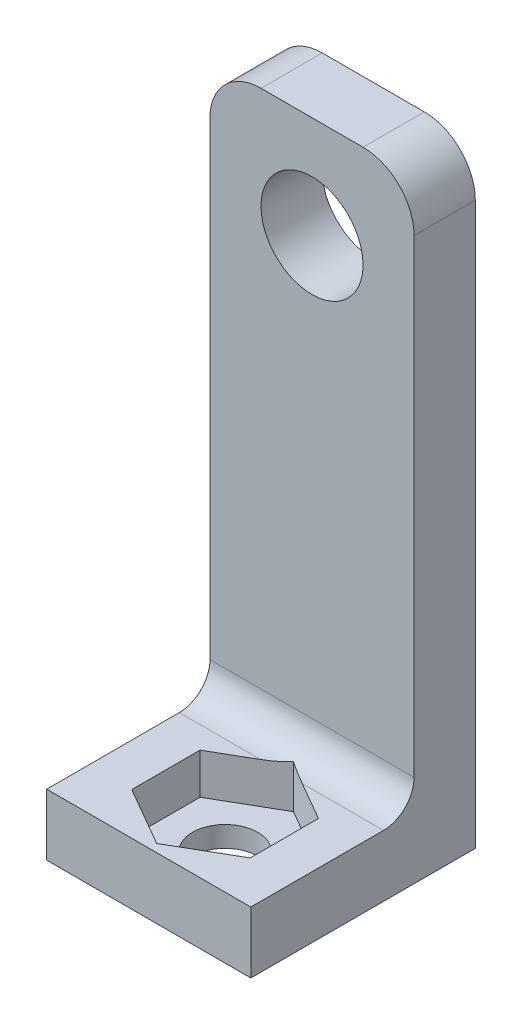
ISO-10303-21;
HEADER;
FILE_DESCRIPTION(('STEP AP214'),'2;1');
FILE_NAME('part.step','',(''),(''),'','','');
FILE_SCHEMA(('AUTOMOTIVE_DESIGN { 1 0 10303 214 1 1 1 1 }'));
ENDSEC;
DATA;
#1=APPLICATION_CONTEXT('core data for automotive mechanical design processes');
#2=APPLICATION_PROTOCOL_DEFINITION('international standard','automotive_design',2000,#1);
#3=PRODUCT_CONTEXT('',#1,'mechanical');
#4=PRODUCT('Part','Part','',(#3));
#5=PRODUCT_RELATED_PRODUCT_CATEGORY('part','',(#4));
#6=PRODUCT_DEFINITION_FORMATION('','',#4);
#7=PRODUCT_DEFINITION_CONTEXT('part definition',#1,'design');
#8=PRODUCT_DEFINITION('design','',#6,#7);
#9=PRODUCT_DEFINITION_SHAPE('','',#8);
#10=(LENGTH_UNIT() NAMED_UNIT(*) SI_UNIT(.MILLI.,.METRE.));
#11=(NAMED_UNIT(*) PLANE_ANGLE_UNIT() SI_UNIT($,.RADIAN.));
#12=(NAMED_UNIT(*) SI_UNIT($,.STERADIAN.) SOLID_ANGLE_UNIT());
#13=UNCERTAINTY_MEASURE_WITH_UNIT(LENGTH_MEASURE(1.E-05),#10,'distance_accuracy_value','');
#14=(GEOMETRIC_REPRESENTATION_CONTEXT(3) GLOBAL_UNCERTAINTY_ASSIGNED_CONTEXT((#13)) GLOBAL_UNIT_ASSIGNED_CONTEXT((#10,
#11,#12)) REPRESENTATION_CONTEXT('',''));
#15=CARTESIAN_POINT('',(0.,0.,0.));
#16=DIRECTION('',(0.,0.,1.));
#17=DIRECTION('',(1.,0.,0.));
#18=AXIS2_PLACEMENT_3D('',#15,#16,#17);
#19=CARTESIAN_POINT('',(0.,-18.9884683776237,7.25918718706481));
#20=DIRECTION('',(0.,1.,0.));
#21=DIRECTION('',(0.,0.,1.));
#22=AXIS2_PLACEMENT_3D('',#19,#20,#21);
#23=CYLINDRICAL_SURFACE('',#22,1.6);
#24=CARTESIAN_POINT('',(0.,-15.,7.25918718706481));
#25=DIRECTION('',(0.,1.,0.));
#26=DIRECTION('',(0.,0.,1.));
#27=AXIS2_PLACEMENT_3D('',#24,#25,#26);
#28=CIRCLE('',#27,1.6);
#29=CARTESIAN_POINT('',(0.,-15.,8.85918718706481));
#30=VERTEX_POINT('',#29);
#31=EDGE_CURVE('E207',#30,#30,#28,.T.);
#32=ORIENTED_EDGE('',*,*,#31,.F.);
#33=EDGE_LOOP('',(#32));
#34=FACE_BOUND('',#33,.T.);
#35=CARTESIAN_POINT('',(0.,-13.9884683776237,7.25918718706481));
#36=DIRECTION('',(0.,1.,0.));
#37=DIRECTION('',(0.,0.,1.));
#38=AXIS2_PLACEMENT_3D('',#35,#36,#37);
#39=CIRCLE('',#38,1.6);
#40=CARTESIAN_POINT('',(0.,-13.9884683776237,8.85918718706481));
#41=VERTEX_POINT('',#40);
#42=EDGE_CURVE('E199',#41,#41,#39,.F.);
#43=ORIENTED_EDGE('',*,*,#42,.F.);
#44=EDGE_LOOP('',(#43));
#45=FACE_BOUND('',#44,.T.);
#46=ADVANCED_FACE('F35',(#34,#45),#23,.F.);
#47=CARTESIAN_POINT('',(5.,15.,3.));
#48=DIRECTION('',(-1.,0.,0.));
#49=DIRECTION('',(0.,-1.,0.));
#50=AXIS2_PLACEMENT_3D('',#47,#48,#49);
#51=PLANE('',#50);
#52=DIRECTION('',(0.,1.,0.));
#53=VECTOR('',#52,1.);
#54=CARTESIAN_POINT('',(5.,15.,0.));
#55=LINE('',#54,#53);
#56=CARTESIAN_POINT('',(5.,-15.,0.));
#57=VERTEX_POINT('',#56);
#58=CARTESIAN_POINT('',(5.,12.5,0.));
#59=VERTEX_POINT('',#58);
#60=EDGE_CURVE('E229',#57,#59,#55,.T.);
#61=ORIENTED_EDGE('',*,*,#60,.T.);
#62=DIRECTION('',(0.,0.,-1.));
#63=VECTOR('',#62,1.);
#64=CARTESIAN_POINT('',(5.,12.5,3.));
#65=LINE('',#64,#63);
#66=CARTESIAN_POINT('',(5.,12.5,3.));
#67=VERTEX_POINT('',#66);
#68=EDGE_CURVE('E259',#59,#67,#65,.F.);
#69=ORIENTED_EDGE('',*,*,#68,.T.);
#70=DIRECTION('',(0.,1.,0.));
#71=VECTOR('',#70,1.);
#72=CARTESIAN_POINT('',(5.,15.,3.));
#73=LINE('',#72,#71);
#74=CARTESIAN_POINT('',(5.,-10.4884683776237,3.));
#75=VERTEX_POINT('',#74);
#76=EDGE_CURVE('E232',#75,#67,#73,.T.);
#77=ORIENTED_EDGE('',*,*,#76,.F.);
#78=CARTESIAN_POINT('',(5.,-10.4884683776237,4.5));
#79=DIRECTION('',(-1.,0.,0.));
#80=DIRECTION('',(0.,-1.,0.));
#81=AXIS2_PLACEMENT_3D('',#78,#79,#80);
#82=CIRCLE('',#81,1.5);
#83=CARTESIAN_POINT('',(5.,-11.9884683776237,4.5));
#84=VERTEX_POINT('',#83);
#85=EDGE_CURVE('E11',#75,#84,#82,.T.);
#86=ORIENTED_EDGE('',*,*,#85,.T.);
#87=DIRECTION('',(0.,0.,-1.));
#88=VECTOR('',#87,1.);
#89=CARTESIAN_POINT('',(5.,-11.9884683776237,11.));
#90=LINE('',#89,#88);
#91=CARTESIAN_POINT('',(5.,-11.9884683776237,11.));
#92=VERTEX_POINT('',#91);
#93=EDGE_CURVE('E222',#92,#84,#90,.T.);
#94=ORIENTED_EDGE('',*,*,#93,.F.);
#95=DIRECTION('',(0.,1.,0.));
#96=VECTOR('',#95,1.);
#97=CARTESIAN_POINT('',(5.,-15.,11.));
#98=LINE('',#97,#96);
#99=CARTESIAN_POINT('',(5.,-15.,11.));
#100=VERTEX_POINT('',#99);
#101=EDGE_CURVE('E216',#100,#92,#98,.T.);
#102=ORIENTED_EDGE('',*,*,#101,.F.);
#103=DIRECTION('',(0.,0.,-1.));
#104=VECTOR('',#103,1.);
#105=CARTESIAN_POINT('',(5.,-15.,3.));
#106=LINE('',#105,#104);
#107=EDGE_CURVE('E240',#100,#57,#106,.T.);
#108=ORIENTED_EDGE('',*,*,#107,.T.);
#109=EDGE_LOOP('',(#61,#69,#77,#86,#94,#102,#108));
#110=FACE_BOUND('',#109,.T.);
#111=ADVANCED_FACE('F303',(#110),#51,.F.);
#112=CARTESIAN_POINT('',(-5.,15.,3.));
#113=DIRECTION('',(0.,-1.,0.));
#114=DIRECTION('',(0.,0.,-1.));
#115=AXIS2_PLACEMENT_3D('',#112,#113,#114);
#116=PLANE('',#115);
#117=DIRECTION('',(-1.,0.,0.));
#118=VECTOR('',#117,1.);
#119=CARTESIAN_POINT('',(-5.,15.,0.));
#120=LINE('',#119,#118);
#121=CARTESIAN_POINT('',(2.5,15.,0.));
#122=VERTEX_POINT('',#121);
#123=CARTESIAN_POINT('',(-2.5,15.,0.));
#124=VERTEX_POINT('',#123);
#125=EDGE_CURVE('E243',#122,#124,#120,.T.);
#126=ORIENTED_EDGE('',*,*,#125,.T.);
#127=DIRECTION('',(0.,0.,-1.));
#128=VECTOR('',#127,1.);
#129=CARTESIAN_POINT('',(-2.5,15.,3.));
#130=LINE('',#129,#128);
#131=CARTESIAN_POINT('',(-2.5,15.,3.));
#132=VERTEX_POINT('',#131);
#133=EDGE_CURVE('E269',#124,#132,#130,.F.);
#134=ORIENTED_EDGE('',*,*,#133,.T.);
#135=DIRECTION('',(-1.,0.,0.));
#136=VECTOR('',#135,1.);
#137=CARTESIAN_POINT('',(-5.,15.,3.));
#138=LINE('',#137,#136);
#139=CARTESIAN_POINT('',(2.5,15.,3.));
#140=VERTEX_POINT('',#139);
#141=EDGE_CURVE('E234',#140,#132,#138,.T.);
#142=ORIENTED_EDGE('',*,*,#141,.F.);
#143=DIRECTION('',(0.,0.,-1.));
#144=VECTOR('',#143,1.);
#145=CARTESIAN_POINT('',(2.5,15.,3.));
#146=LINE('',#145,#144);
#147=EDGE_CURVE('E254',#140,#122,#146,.T.);
#148=ORIENTED_EDGE('',*,*,#147,.T.);
#149=EDGE_LOOP('',(#126,#134,#142,#148));
#150=FACE_BOUND('',#149,.T.);
#151=ADVANCED_FACE('F314',(#150),#116,.F.);
#152=CARTESIAN_POINT('',(-5.,15.,3.));
#153=DIRECTION('',(1.,0.,0.));
#154=DIRECTION('',(0.,1.,0.));
#155=AXIS2_PLACEMENT_3D('',#152,#153,#154);
#156=PLANE('',#155);
#157=DIRECTION('',(0.,-1.,0.));
#158=VECTOR('',#157,1.);
#159=CARTESIAN_POINT('',(-5.,15.,3.));
#160=LINE('',#159,#158);
#161=CARTESIAN_POINT('',(-5.,12.5,3.));
#162=VERTEX_POINT('',#161);
#163=CARTESIAN_POINT('',(-5.,-10.4884683776237,3.));
#164=VERTEX_POINT('',#163);
#165=EDGE_CURVE('E238',#162,#164,#160,.T.);
#166=ORIENTED_EDGE('',*,*,#165,.F.);
#167=DIRECTION('',(0.,0.,-1.));
#168=VECTOR('',#167,1.);
#169=CARTESIAN_POINT('',(-5.,12.5,3.));
#170=LINE('',#169,#168);
#171=CARTESIAN_POINT('',(-5.,12.5,0.));
#172=VERTEX_POINT('',#171);
#173=EDGE_CURVE('E264',#162,#172,#170,.T.);
#174=ORIENTED_EDGE('',*,*,#173,.T.);
#175=DIRECTION('',(0.,-1.,0.));
#176=VECTOR('',#175,1.);
#177=CARTESIAN_POINT('',(-5.,15.,0.));
#178=LINE('',#177,#176);
#179=CARTESIAN_POINT('',(-5.,-15.,0.));
#180=VERTEX_POINT('',#179);
#181=EDGE_CURVE('E246',#172,#180,#178,.T.);
#182=ORIENTED_EDGE('',*,*,#181,.T.);
#183=DIRECTION('',(0.,0.,-1.));
#184=VECTOR('',#183,1.);
#185=CARTESIAN_POINT('',(-5.,-15.,3.));
#186=LINE('',#185,#184);
#187=CARTESIAN_POINT('',(-5.,-15.,11.));
#188=VERTEX_POINT('',#187);
#189=EDGE_CURVE('E251',#188,#180,#186,.T.);
#190=ORIENTED_EDGE('',*,*,#189,.F.);
#191=DIRECTION('',(0.,-1.,0.));
#192=VECTOR('',#191,1.);
#193=CARTESIAN_POINT('',(-5.,-15.,11.));
#194=LINE('',#193,#192);
#195=CARTESIAN_POINT('',(-5.,-11.9884683776237,11.));
#196=VERTEX_POINT('',#195);
#197=EDGE_CURVE('E210',#196,#188,#194,.T.);
#198=ORIENTED_EDGE('',*,*,#197,.F.);
#199=DIRECTION('',(0.,0.,-1.));
#200=VECTOR('',#199,1.);
#201=CARTESIAN_POINT('',(-5.,-11.9884683776237,11.));
#202=LINE('',#201,#200);
#203=CARTESIAN_POINT('',(-5.,-11.9884683776237,4.5));
#204=VERTEX_POINT('',#203);
#205=EDGE_CURVE('E220',#196,#204,#202,.T.);
#206=ORIENTED_EDGE('',*,*,#205,.T.);
#207=CARTESIAN_POINT('',(-5.,-10.4884683776237,4.5));
#208=DIRECTION('',(1.,0.,0.));
#209=DIRECTION('',(0.,1.,0.));
#210=AXIS2_PLACEMENT_3D('',#207,#208,#209);
#211=CIRCLE('',#210,1.5);
#212=EDGE_CURVE('E43',#204,#164,#211,.T.);
#213=ORIENTED_EDGE('',*,*,#212,.T.);
#214=EDGE_LOOP('',(#166,#174,#182,#190,#198,#206,#213));
#215=FACE_BOUND('',#214,.T.);
#216=ADVANCED_FACE('F320',(#215),#156,.F.);
#217=CARTESIAN_POINT('',(-5.,-15.,3.));
#218=DIRECTION('',(0.,1.,0.));
#219=DIRECTION('',(0.,0.,1.));
#220=AXIS2_PLACEMENT_3D('',#217,#218,#219);
#221=PLANE('',#220);
#222=ORIENTED_EDGE('',*,*,#31,.T.);
#223=EDGE_LOOP('',(#222));
#224=FACE_BOUND('',#223,.T.);
#225=DIRECTION('',(1.,0.,0.));
#226=VECTOR('',#225,1.);
#227=CARTESIAN_POINT('',(-5.,-15.,0.));
#228=LINE('',#227,#226);
#229=EDGE_CURVE('E235',#180,#57,#228,.T.);
#230=ORIENTED_EDGE('',*,*,#229,.T.);
#231=ORIENTED_EDGE('',*,*,#107,.F.);
#232=DIRECTION('',(1.,0.,0.));
#233=VECTOR('',#232,1.);
#234=CARTESIAN_POINT('',(-5.,-15.,11.));
#235=LINE('',#234,#233);
#236=EDGE_CURVE('E213',#188,#100,#235,.T.);
#237=ORIENTED_EDGE('',*,*,#236,.F.);
#238=ORIENTED_EDGE('',*,*,#189,.T.);
#239=EDGE_LOOP('',(#230,#231,#237,#238));
#240=FACE_BOUND('',#239,.T.);
#241=ADVANCED_FACE('F326',(#224,#240),#221,.F.);
#242=CARTESIAN_POINT('',(0.,0.,3.));
#243=DIRECTION('',(0.,0.,1.));
#244=DIRECTION('',(1.,0.,0.));
#245=AXIS2_PLACEMENT_3D('',#242,#243,#244);
#246=PLANE('',#245);
#247=ORIENTED_EDGE('',*,*,#165,.T.);
#248=DIRECTION('',(-1.,0.,0.));
#249=VECTOR('',#248,1.);
#250=CARTESIAN_POINT('',(0.,-10.4884683776237,3.));
#251=LINE('',#250,#249);
#252=EDGE_CURVE('E280',#164,#75,#251,.F.);
#253=ORIENTED_EDGE('',*,*,#252,.T.);
#254=ORIENTED_EDGE('',*,*,#76,.T.);
#255=CARTESIAN_POINT('',(2.5,12.5,3.));
#256=DIRECTION('',(0.,0.,1.));
#257=DIRECTION('',(1.,0.,0.));
#258=AXIS2_PLACEMENT_3D('',#255,#256,#257);
#259=CIRCLE('',#258,2.5);
#260=EDGE_CURVE('E262',#67,#140,#259,.T.);
#261=ORIENTED_EDGE('',*,*,#260,.T.);
#262=ORIENTED_EDGE('',*,*,#141,.T.);
#263=CARTESIAN_POINT('',(-2.5,12.5,3.));
#264=DIRECTION('',(0.,0.,1.));
#265=DIRECTION('',(1.,0.,0.));
#266=AXIS2_PLACEMENT_3D('',#263,#264,#265);
#267=CIRCLE('',#266,2.5);
#268=EDGE_CURVE('E271',#132,#162,#267,.T.);
#269=ORIENTED_EDGE('',*,*,#268,.T.);
#270=EDGE_LOOP('',(#247,#253,#254,#261,#262,#269));
#271=FACE_BOUND('',#270,.T.);
#272=CARTESIAN_POINT('',(0.,10.,3.));
#273=DIRECTION('',(0.,0.,-1.));
#274=DIRECTION('',(-1.,0.,0.));
#275=AXIS2_PLACEMENT_3D('',#272,#273,#274);
#276=CIRCLE('',#275,2.5);
#277=CARTESIAN_POINT('',(-2.5,10.,3.));
#278=VERTEX_POINT('',#277);
#279=EDGE_CURVE('E226',#278,#278,#276,.T.);
#280=ORIENTED_EDGE('',*,*,#279,.T.);
#281=EDGE_LOOP('',(#280));
#282=FACE_BOUND('',#281,.T.);
#283=ADVANCED_FACE('F300',(#271,#282),#246,.T.);
#284=CARTESIAN_POINT('',(0.,0.,0.));
#285=DIRECTION('',(0.,0.,1.));
#286=DIRECTION('',(1.,0.,0.));
#287=AXIS2_PLACEMENT_3D('',#284,#285,#286);
#288=PLANE('',#287);
#289=CARTESIAN_POINT('',(0.,10.,0.));
#290=DIRECTION('',(0.,0.,-1.));
#291=DIRECTION('',(-1.,0.,0.));
#292=AXIS2_PLACEMENT_3D('',#289,#290,#291);
#293=CIRCLE('',#292,2.5);
#294=CARTESIAN_POINT('',(-2.5,10.,0.));
#295=VERTEX_POINT('',#294);
#296=EDGE_CURVE('E225',#295,#295,#293,.T.);
#297=ORIENTED_EDGE('',*,*,#296,.F.);
#298=EDGE_LOOP('',(#297));
#299=FACE_BOUND('',#298,.T.);
#300=ORIENTED_EDGE('',*,*,#181,.F.);
#301=CARTESIAN_POINT('',(-2.5,12.5,0.));
#302=DIRECTION('',(0.,0.,1.));
#303=DIRECTION('',(1.,0.,0.));
#304=AXIS2_PLACEMENT_3D('',#301,#302,#303);
#305=CIRCLE('',#304,2.5);
#306=EDGE_CURVE('E267',#172,#124,#305,.F.);
#307=ORIENTED_EDGE('',*,*,#306,.T.);
#308=ORIENTED_EDGE('',*,*,#125,.F.);
#309=CARTESIAN_POINT('',(2.5,12.5,0.));
#310=DIRECTION('',(0.,0.,1.));
#311=DIRECTION('',(1.,0.,0.));
#312=AXIS2_PLACEMENT_3D('',#309,#310,#311);
#313=CIRCLE('',#312,2.5);
#314=EDGE_CURVE('E257',#122,#59,#313,.F.);
#315=ORIENTED_EDGE('',*,*,#314,.T.);
#316=ORIENTED_EDGE('',*,*,#60,.F.);
#317=ORIENTED_EDGE('',*,*,#229,.F.);
#318=EDGE_LOOP('',(#300,#307,#308,#315,#316,#317));
#319=FACE_BOUND('',#318,.T.);
#320=ADVANCED_FACE('F324',(#299,#319),#288,.F.);
#321=CARTESIAN_POINT('',(0.,10.,3.));
#322=DIRECTION('',(0.,0.,-1.));
#323=DIRECTION('',(-1.,0.,0.));
#324=AXIS2_PLACEMENT_3D('',#321,#322,#323);
#325=CYLINDRICAL_SURFACE('',#324,2.5);
#326=ORIENTED_EDGE('',*,*,#279,.F.);
#327=EDGE_LOOP('',(#326));
#328=FACE_BOUND('',#327,.T.);
#329=ORIENTED_EDGE('',*,*,#296,.T.);
#330=EDGE_LOOP('',(#329));
#331=FACE_BOUND('',#330,.T.);
#332=ADVANCED_FACE('F365',(#328,#331),#325,.F.);
#333=CARTESIAN_POINT('',(2.5,12.5,3.));
#334=DIRECTION('',(0.,0.,-1.));
#335=DIRECTION('',(-1.,0.,0.));
#336=AXIS2_PLACEMENT_3D('',#333,#334,#335);
#337=CYLINDRICAL_SURFACE('',#336,2.5);
#338=ORIENTED_EDGE('',*,*,#260,.F.);
#339=ORIENTED_EDGE('',*,*,#68,.F.);
#340=ORIENTED_EDGE('',*,*,#314,.F.);
#341=ORIENTED_EDGE('',*,*,#147,.F.);
#342=EDGE_LOOP('',(#338,#339,#340,#341));
#343=FACE_BOUND('',#342,.T.);
#344=ADVANCED_FACE('F310',(#343),#337,.T.);
#345=CARTESIAN_POINT('',(-2.5,12.5,3.));
#346=DIRECTION('',(0.,0.,-1.));
#347=DIRECTION('',(-1.,0.,0.));
#348=AXIS2_PLACEMENT_3D('',#345,#346,#347);
#349=CYLINDRICAL_SURFACE('',#348,2.5);
#350=ORIENTED_EDGE('',*,*,#268,.F.);
#351=ORIENTED_EDGE('',*,*,#133,.F.);
#352=ORIENTED_EDGE('',*,*,#306,.F.);
#353=ORIENTED_EDGE('',*,*,#173,.F.);
#354=EDGE_LOOP('',(#350,#351,#352,#353));
#355=FACE_BOUND('',#354,.T.);
#356=ADVANCED_FACE('F318',(#355),#349,.T.);
#357=CARTESIAN_POINT('',(-5.,-11.9884683776237,11.));
#358=DIRECTION('',(0.,-1.,0.));
#359=DIRECTION('',(0.,0.,-1.));
#360=AXIS2_PLACEMENT_3D('',#357,#358,#359);
#361=PLANE('',#360);
#362=ORIENTED_EDGE('',*,*,#93,.T.);
#363=DIRECTION('',(-1.,0.,0.));
#364=VECTOR('',#363,1.);
#365=CARTESIAN_POINT('',(-5.,-11.9884683776237,4.5));
#366=LINE('',#365,#364);
#367=CARTESIAN_POINT('',(1.0209476044107,-11.9884683776237,4.5));
#368=VERTEX_POINT('',#367);
#369=EDGE_CURVE('E277',#84,#368,#366,.T.);
#370=ORIENTED_EDGE('',*,*,#369,.T.);
#371=DIRECTION('',(-0.866025403784439,0.,-0.5));
#372=VECTOR('',#371,1.);
#373=CARTESIAN_POINT('',(2.9,-11.9884683776237,5.58487140641489));
#374=LINE('',#373,#372);
#375=CARTESIAN_POINT('',(2.9,-11.9884683776237,5.58487140641489));
#376=VERTEX_POINT('',#375);
#377=EDGE_CURVE('E190',#376,#368,#374,.T.);
#378=ORIENTED_EDGE('',*,*,#377,.F.);
#379=DIRECTION('',(0.,0.,-1.));
#380=VECTOR('',#379,1.);
#381=CARTESIAN_POINT('',(2.9,-11.9884683776237,8.93350296771472));
#382=LINE('',#381,#380);
#383=CARTESIAN_POINT('',(2.9,-11.9884683776237,8.93350296771472));
#384=VERTEX_POINT('',#383);
#385=EDGE_CURVE('E188',#384,#376,#382,.T.);
#386=ORIENTED_EDGE('',*,*,#385,.F.);
#387=DIRECTION('',(0.866025403784439,0.,-0.5));
#388=VECTOR('',#387,1.);
#389=CARTESIAN_POINT('',(0.,-11.9884683776237,10.6078187483646));
#390=LINE('',#389,#388);
#391=CARTESIAN_POINT('',(0.,-11.9884683776237,10.6078187483646));
#392=VERTEX_POINT('',#391);
#393=EDGE_CURVE('E155',#392,#384,#390,.T.);
#394=ORIENTED_EDGE('',*,*,#393,.F.);
#395=DIRECTION('',(0.866025403784439,0.,0.5));
#396=VECTOR('',#395,1.);
#397=CARTESIAN_POINT('',(-2.9,-11.9884683776237,8.93350296771472));
#398=LINE('',#397,#396);
#399=CARTESIAN_POINT('',(-2.9,-11.9884683776237,8.93350296771472));
#400=VERTEX_POINT('',#399);
#401=EDGE_CURVE('E174',#400,#392,#398,.T.);
#402=ORIENTED_EDGE('',*,*,#401,.F.);
#403=DIRECTION('',(0.,0.,1.));
#404=VECTOR('',#403,1.);
#405=CARTESIAN_POINT('',(-2.9,-11.9884683776237,5.58487140641489));
#406=LINE('',#405,#404);
#407=CARTESIAN_POINT('',(-2.9,-11.9884683776237,5.58487140641489));
#408=VERTEX_POINT('',#407);
#409=EDGE_CURVE('E177',#408,#400,#406,.T.);
#410=ORIENTED_EDGE('',*,*,#409,.F.);
#411=DIRECTION('',(-0.866025403784439,0.,0.5));
#412=VECTOR('',#411,1.);
#413=CARTESIAN_POINT('',(0.,-11.9884683776237,3.91055562576498));
#414=LINE('',#413,#412);
#415=CARTESIAN_POINT('',(-1.0209476044107,-11.9884683776237,4.5));
#416=VERTEX_POINT('',#415);
#417=EDGE_CURVE('E193',#416,#408,#414,.T.);
#418=ORIENTED_EDGE('',*,*,#417,.F.);
#419=DIRECTION('',(-1.,0.,0.));
#420=VECTOR('',#419,1.);
#421=CARTESIAN_POINT('',(-5.,-11.9884683776237,4.5));
#422=LINE('',#421,#420);
#423=EDGE_CURVE('E273',#416,#204,#422,.T.);
#424=ORIENTED_EDGE('',*,*,#423,.T.);
#425=ORIENTED_EDGE('',*,*,#205,.F.);
#426=DIRECTION('',(-1.,0.,0.));
#427=VECTOR('',#426,1.);
#428=CARTESIAN_POINT('',(-5.,-11.9884683776237,11.));
#429=LINE('',#428,#427);
#430=EDGE_CURVE('E218',#92,#196,#429,.T.);
#431=ORIENTED_EDGE('',*,*,#430,.F.);
#432=EDGE_LOOP('',(#362,#370,#378,#386,#394,#402,#410,#418,#424,#425,#431));
#433=FACE_BOUND('',#432,.T.);
#434=ADVANCED_FACE('F292',(#433),#361,.F.);
#435=CARTESIAN_POINT('',(0.,0.,11.));
#436=DIRECTION('',(0.,0.,-1.));
#437=DIRECTION('',(-1.,0.,0.));
#438=AXIS2_PLACEMENT_3D('',#435,#436,#437);
#439=PLANE('',#438);
#440=ORIENTED_EDGE('',*,*,#197,.T.);
#441=ORIENTED_EDGE('',*,*,#236,.T.);
#442=ORIENTED_EDGE('',*,*,#101,.T.);
#443=ORIENTED_EDGE('',*,*,#430,.T.);
#444=EDGE_LOOP('',(#440,#441,#442,#443));
#445=FACE_BOUND('',#444,.T.);
#446=ADVANCED_FACE('F331',(#445),#439,.F.);
#447=CARTESIAN_POINT('',(0.,-13.9884683776237,0.));
#448=DIRECTION('',(0.,1.,0.));
#449=DIRECTION('',(0.,0.,1.));
#450=AXIS2_PLACEMENT_3D('',#447,#448,#449);
#451=PLANE('',#450);
#452=DIRECTION('',(0.866025403784439,0.,-0.5));
#453=VECTOR('',#452,1.);
#454=CARTESIAN_POINT('',(0.,-13.9884683776237,10.6078187483646));
#455=LINE('',#454,#453);
#456=CARTESIAN_POINT('',(0.,-13.9884683776237,10.6078187483646));
#457=VERTEX_POINT('',#456);
#458=CARTESIAN_POINT('',(2.9,-13.9884683776237,8.93350296771472));
#459=VERTEX_POINT('',#458);
#460=EDGE_CURVE('E152',#457,#459,#455,.T.);
#461=ORIENTED_EDGE('',*,*,#460,.T.);
#462=DIRECTION('',(0.,0.,-1.));
#463=VECTOR('',#462,1.);
#464=CARTESIAN_POINT('',(2.9,-13.9884683776237,8.93350296771472));
#465=LINE('',#464,#463);
#466=CARTESIAN_POINT('',(2.9,-13.9884683776237,5.58487140641489));
#467=VERTEX_POINT('',#466);
#468=EDGE_CURVE('E163',#459,#467,#465,.T.);
#469=ORIENTED_EDGE('',*,*,#468,.T.);
#470=DIRECTION('',(-0.866025403784439,0.,-0.5));
#471=VECTOR('',#470,1.);
#472=CARTESIAN_POINT('',(2.9,-13.9884683776237,5.58487140641489));
#473=LINE('',#472,#471);
#474=CARTESIAN_POINT('',(0.,-13.9884683776237,3.91055562576498));
#475=VERTEX_POINT('',#474);
#476=EDGE_CURVE('E168',#467,#475,#473,.T.);
#477=ORIENTED_EDGE('',*,*,#476,.T.);
#478=DIRECTION('',(-0.866025403784439,0.,0.5));
#479=VECTOR('',#478,1.);
#480=CARTESIAN_POINT('',(0.,-13.9884683776237,3.91055562576498));
#481=LINE('',#480,#479);
#482=CARTESIAN_POINT('',(-2.9,-13.9884683776237,5.58487140641489));
#483=VERTEX_POINT('',#482);
#484=EDGE_CURVE('E181',#475,#483,#481,.T.);
#485=ORIENTED_EDGE('',*,*,#484,.T.);
#486=DIRECTION('',(0.,0.,1.));
#487=VECTOR('',#486,1.);
#488=CARTESIAN_POINT('',(-2.9,-13.9884683776237,5.58487140641489));
#489=LINE('',#488,#487);
#490=CARTESIAN_POINT('',(-2.9,-13.9884683776237,8.93350296771472));
#491=VERTEX_POINT('',#490);
#492=EDGE_CURVE('E184',#483,#491,#489,.T.);
#493=ORIENTED_EDGE('',*,*,#492,.T.);
#494=DIRECTION('',(0.866025403784439,0.,0.5));
#495=VECTOR('',#494,1.);
#496=CARTESIAN_POINT('',(-2.9,-13.9884683776237,8.93350296771472));
#497=LINE('',#496,#495);
#498=EDGE_CURVE('E160',#491,#457,#497,.T.);
#499=ORIENTED_EDGE('',*,*,#498,.T.);
#500=EDGE_LOOP('',(#461,#469,#477,#485,#493,#499));
#501=FACE_BOUND('',#500,.T.);
#502=ORIENTED_EDGE('',*,*,#42,.T.);
#503=EDGE_LOOP('',(#502));
#504=FACE_BOUND('',#503,.T.);
#505=ADVANCED_FACE('F170',(#501,#504),#451,.T.);
#506=CARTESIAN_POINT('',(0.,-13.9884683776237,10.6078187483646));
#507=DIRECTION('',(0.5,0.,0.866025403784439));
#508=DIRECTION('',(0.866025403784439,0.,-0.5));
#509=AXIS2_PLACEMENT_3D('',#506,#507,#508);
#510=PLANE('',#509);
#511=ORIENTED_EDGE('',*,*,#393,.T.);
#512=DIRECTION('',(0.,1.,0.));
#513=VECTOR('',#512,1.);
#514=CARTESIAN_POINT('',(2.9,-13.9884683776237,8.93350296771472));
#515=LINE('',#514,#513);
#516=EDGE_CURVE('E148',#459,#384,#515,.T.);
#517=ORIENTED_EDGE('',*,*,#516,.F.);
#518=ORIENTED_EDGE('',*,*,#460,.F.);
#519=DIRECTION('',(0.,1.,0.));
#520=VECTOR('',#519,1.);
#521=CARTESIAN_POINT('',(0.,-13.9884683776237,10.6078187483646));
#522=LINE('',#521,#520);
#523=EDGE_CURVE('E197',#457,#392,#522,.T.);
#524=ORIENTED_EDGE('',*,*,#523,.T.);
#525=EDGE_LOOP('',(#511,#517,#518,#524));
#526=FACE_BOUND('',#525,.T.);
#527=ADVANCED_FACE('F150',(#526),#510,.F.);
#528=CARTESIAN_POINT('',(-2.9,-13.9884683776237,8.93350296771472));
#529=DIRECTION('',(-0.5,0.,0.866025403784439));
#530=DIRECTION('',(0.866025403784439,0.,0.5));
#531=AXIS2_PLACEMENT_3D('',#528,#529,#530);
#532=PLANE('',#531);
#533=ORIENTED_EDGE('',*,*,#401,.T.);
#534=ORIENTED_EDGE('',*,*,#523,.F.);
#535=ORIENTED_EDGE('',*,*,#498,.F.);
#536=DIRECTION('',(0.,1.,0.));
#537=VECTOR('',#536,1.);
#538=CARTESIAN_POINT('',(-2.9,-13.9884683776237,8.93350296771472));
#539=LINE('',#538,#537);
#540=EDGE_CURVE('E200',#491,#400,#539,.T.);
#541=ORIENTED_EDGE('',*,*,#540,.T.);
#542=EDGE_LOOP('',(#533,#534,#535,#541));
#543=FACE_BOUND('',#542,.T.);
#544=ADVANCED_FACE('F337',(#543),#532,.F.);
#545=CARTESIAN_POINT('',(-2.9,-13.9884683776237,5.58487140641489));
#546=DIRECTION('',(-1.,0.,0.));
#547=DIRECTION('',(0.,0.,1.));
#548=AXIS2_PLACEMENT_3D('',#545,#546,#547);
#549=PLANE('',#548);
#550=ORIENTED_EDGE('',*,*,#409,.T.);
#551=ORIENTED_EDGE('',*,*,#540,.F.);
#552=ORIENTED_EDGE('',*,*,#492,.F.);
#553=DIRECTION('',(0.,1.,0.));
#554=VECTOR('',#553,1.);
#555=CARTESIAN_POINT('',(-2.9,-13.9884683776237,5.58487140641489));
#556=LINE('',#555,#554);
#557=EDGE_CURVE('E202',#483,#408,#556,.T.);
#558=ORIENTED_EDGE('',*,*,#557,.T.);
#559=EDGE_LOOP('',(#550,#551,#552,#558));
#560=FACE_BOUND('',#559,.T.);
#561=ADVANCED_FACE('F340',(#560),#549,.F.);
#562=CARTESIAN_POINT('',(0.,-13.9884683776237,3.91055562576498));
#563=DIRECTION('',(-0.5,0.,-0.866025403784439));
#564=DIRECTION('',(-0.866025403784439,0.,0.5));
#565=AXIS2_PLACEMENT_3D('',#562,#563,#564);
#566=PLANE('',#565);
#567=DIRECTION('',(0.,1.,0.));
#568=VECTOR('',#567,1.);
#569=CARTESIAN_POINT('',(0.,-13.9884683776237,3.91055562576498));
#570=LINE('',#569,#568);
#571=CARTESIAN_POINT('',(0.,-11.8677998568867,3.91055562576498));
#572=VERTEX_POINT('',#571);
#573=EDGE_CURVE('E50',#475,#572,#570,.T.);
#574=ORIENTED_EDGE('',*,*,#573,.T.);
#575=CARTESIAN_POINT('',(-1.0209476044107,-10.4884683776237,4.5));
#576=DIRECTION('',(-0.5,0.,-0.866025403784439));
#577=DIRECTION('',(-0.866025403784439,0.,0.5));
#578=AXIS2_PLACEMENT_3D('',#575,#576,#577);
#579=ELLIPSE('',#578,3.,1.5);
#580=EDGE_CURVE('E284',#572,#416,#579,.T.);
#581=ORIENTED_EDGE('',*,*,#580,.T.);
#582=ORIENTED_EDGE('',*,*,#417,.T.);
#583=ORIENTED_EDGE('',*,*,#557,.F.);
#584=ORIENTED_EDGE('',*,*,#484,.F.);
#585=EDGE_LOOP('',(#574,#581,#582,#583,#584));
#586=FACE_BOUND('',#585,.T.);
#587=ADVANCED_FACE('F287',(#586),#566,.F.);
#588=CARTESIAN_POINT('',(2.9,-13.9884683776237,5.58487140641489));
#589=DIRECTION('',(0.5,0.,-0.866025403784439));
#590=DIRECTION('',(-0.866025403784439,0.,-0.5));
#591=AXIS2_PLACEMENT_3D('',#588,#589,#590);
#592=PLANE('',#591);
#593=ORIENTED_EDGE('',*,*,#377,.T.);
#594=CARTESIAN_POINT('',(1.0209476044107,-10.4884683776237,4.5));
#595=DIRECTION('',(0.5,0.,-0.866025403784439));
#596=DIRECTION('',(-0.866025403784439,0.,-0.5));
#597=AXIS2_PLACEMENT_3D('',#594,#595,#596);
#598=ELLIPSE('',#597,3.,1.5);
#599=EDGE_CURVE('E282',#368,#572,#598,.T.);
#600=ORIENTED_EDGE('',*,*,#599,.T.);
#601=ORIENTED_EDGE('',*,*,#573,.F.);
#602=ORIENTED_EDGE('',*,*,#476,.F.);
#603=DIRECTION('',(0.,1.,0.));
#604=VECTOR('',#603,1.);
#605=CARTESIAN_POINT('',(2.9,-13.9884683776237,5.58487140641489));
#606=LINE('',#605,#604);
#607=EDGE_CURVE('E159',#467,#376,#606,.T.);
#608=ORIENTED_EDGE('',*,*,#607,.T.);
#609=EDGE_LOOP('',(#593,#600,#601,#602,#608));
#610=FACE_BOUND('',#609,.T.);
#611=ADVANCED_FACE('F335',(#610),#592,.F.);
#612=CARTESIAN_POINT('',(2.9,-13.9884683776237,8.93350296771472));
#613=DIRECTION('',(1.,0.,0.));
#614=DIRECTION('',(0.,0.,-1.));
#615=AXIS2_PLACEMENT_3D('',#612,#613,#614);
#616=PLANE('',#615);
#617=ORIENTED_EDGE('',*,*,#385,.T.);
#618=ORIENTED_EDGE('',*,*,#607,.F.);
#619=ORIENTED_EDGE('',*,*,#468,.F.);
#620=ORIENTED_EDGE('',*,*,#516,.T.);
#621=EDGE_LOOP('',(#617,#618,#619,#620));
#622=FACE_BOUND('',#621,.T.);
#623=ADVANCED_FACE('F164',(#622),#616,.F.);
#624=CARTESIAN_POINT('',(-5.,-10.4884683776237,4.5));
#625=DIRECTION('',(-1.,0.,0.));
#626=DIRECTION('',(0.,0.,1.));
#627=AXIS2_PLACEMENT_3D('',#624,#625,#626);
#628=CYLINDRICAL_SURFACE('',#627,1.5);
#629=ORIENTED_EDGE('',*,*,#85,.F.);
#630=ORIENTED_EDGE('',*,*,#252,.F.);
#631=ORIENTED_EDGE('',*,*,#212,.F.);
#632=ORIENTED_EDGE('',*,*,#423,.F.);
#633=ORIENTED_EDGE('',*,*,#580,.F.);
#634=ORIENTED_EDGE('',*,*,#599,.F.);
#635=ORIENTED_EDGE('',*,*,#369,.F.);
#636=EDGE_LOOP('',(#629,#630,#631,#632,#633,#634,#635));
#637=FACE_BOUND('',#636,.T.);
#638=ADVANCED_FACE('F37',(#637),#628,.F.);
#639=CLOSED_SHELL('',(#46,#111,#151,#216,#241,#283,#320,#332,#344,#356,#434,#446,#505,#527,#544,
#561,#587,#611,#623,#638));
#640=MANIFOLD_SOLID_BREP('B2',#639);
#641=ADVANCED_BREP_SHAPE_REPRESENTATION('',(#18,#640),#14);
#642=SHAPE_DEFINITION_REPRESENTATION(#9,#641);
ENDSEC;
END-ISO-10303-21;
